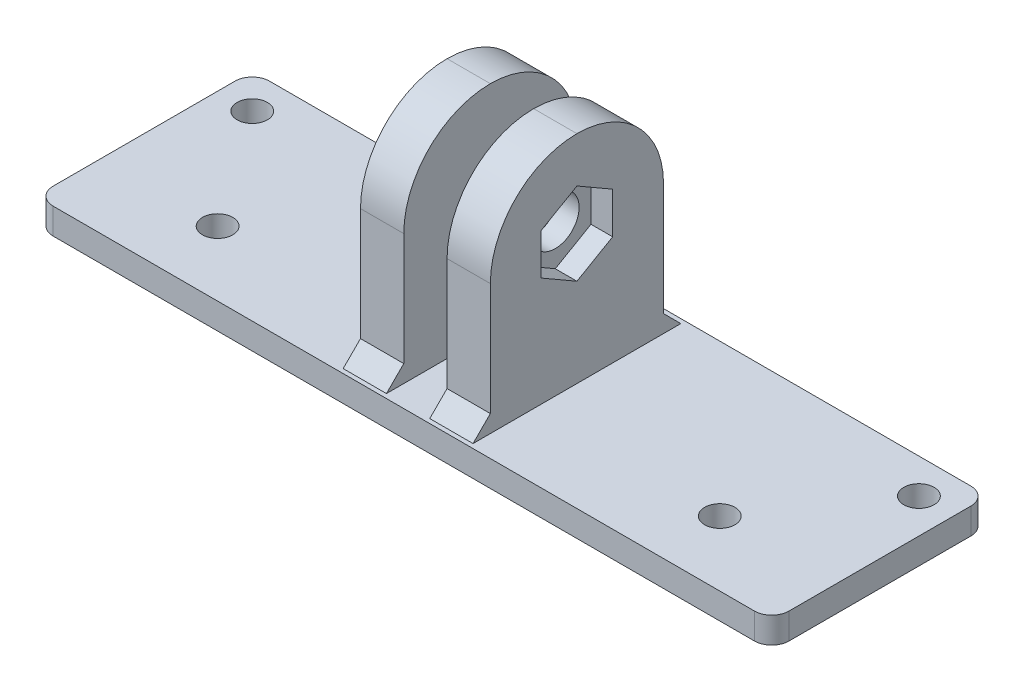
ISO-10303-21;
HEADER;
FILE_DESCRIPTION(('STEP AP214'),'2;1');
FILE_NAME('part.step','',(''),(''),'','','');
FILE_SCHEMA(('AUTOMOTIVE_DESIGN { 1 0 10303 214 1 1 1 1 }'));
ENDSEC;
DATA;
#1=APPLICATION_CONTEXT('core data for automotive mechanical design processes');
#2=APPLICATION_PROTOCOL_DEFINITION('international standard','automotive_design',2000,#1);
#3=PRODUCT_CONTEXT('',#1,'mechanical');
#4=PRODUCT('Part','Part','',(#3));
#5=PRODUCT_RELATED_PRODUCT_CATEGORY('part','',(#4));
#6=PRODUCT_DEFINITION_FORMATION('','',#4);
#7=PRODUCT_DEFINITION_CONTEXT('part definition',#1,'design');
#8=PRODUCT_DEFINITION('design','',#6,#7);
#9=PRODUCT_DEFINITION_SHAPE('','',#8);
#10=(LENGTH_UNIT() NAMED_UNIT(*) SI_UNIT(.MILLI.,.METRE.));
#11=(NAMED_UNIT(*) PLANE_ANGLE_UNIT() SI_UNIT($,.RADIAN.));
#12=(NAMED_UNIT(*) SI_UNIT($,.STERADIAN.) SOLID_ANGLE_UNIT());
#13=UNCERTAINTY_MEASURE_WITH_UNIT(LENGTH_MEASURE(1.E-05),#10,'distance_accuracy_value','');
#14=(GEOMETRIC_REPRESENTATION_CONTEXT(3) GLOBAL_UNCERTAINTY_ASSIGNED_CONTEXT((#13)) GLOBAL_UNIT_ASSIGNED_CONTEXT((#10,
#11,#12)) REPRESENTATION_CONTEXT('',''));
#15=CARTESIAN_POINT('',(0.,0.,0.));
#16=DIRECTION('',(0.,0.,1.));
#17=DIRECTION('',(1.,0.,0.));
#18=AXIS2_PLACEMENT_3D('',#15,#16,#17);
#19=CARTESIAN_POINT('',(42.5,18.,0.));
#20=DIRECTION('',(-1.,0.,0.));
#21=DIRECTION('',(0.,0.,1.));
#22=AXIS2_PLACEMENT_3D('',#19,#20,#21);
#23=CYLINDRICAL_SURFACE('',#22,2.75);
#24=CARTESIAN_POINT('',(2.49999999999994,18.,0.));
#25=DIRECTION('',(1.,0.,0.));
#26=DIRECTION('',(0.,0.,-1.));
#27=AXIS2_PLACEMENT_3D('',#24,#25,#26);
#28=CIRCLE('',#27,2.75);
#29=CARTESIAN_POINT('',(2.49999999999994,18.,-2.75));
#30=VERTEX_POINT('',#29);
#31=EDGE_CURVE('E303',#30,#30,#28,.T.);
#32=ORIENTED_EDGE('',*,*,#31,.F.);
#33=EDGE_LOOP('',(#32));
#34=FACE_BOUND('',#33,.T.);
#35=CARTESIAN_POINT('',(4.99999999999994,18.,0.));
#36=DIRECTION('',(1.,0.,0.));
#37=DIRECTION('',(0.,0.,-1.));
#38=AXIS2_PLACEMENT_3D('',#35,#36,#37);
#39=CIRCLE('',#38,2.75);
#40=CARTESIAN_POINT('',(4.99999999999994,18.,-2.75));
#41=VERTEX_POINT('',#40);
#42=EDGE_CURVE('E291',#41,#41,#39,.F.);
#43=ORIENTED_EDGE('',*,*,#42,.F.);
#44=EDGE_LOOP('',(#43));
#45=FACE_BOUND('',#44,.T.);
#46=ADVANCED_FACE('F39',(#34,#45),#23,.F.);
#47=CARTESIAN_POINT('',(0.,3.,0.));
#48=DIRECTION('',(0.,1.,0.));
#49=DIRECTION('',(0.,0.,1.));
#50=AXIS2_PLACEMENT_3D('',#47,#48,#49);
#51=PLANE('',#50);
#52=CARTESIAN_POINT('',(-38.5,3.,-8.49999999999996));
#53=DIRECTION('',(0.,1.,0.));
#54=DIRECTION('',(0.,0.,1.));
#55=AXIS2_PLACEMENT_3D('',#52,#53,#54);
#56=CIRCLE('',#55,1.75);
#57=CARTESIAN_POINT('',(-38.5,3.,-6.74999999999996));
#58=VERTEX_POINT('',#57);
#59=EDGE_CURVE('E366',#58,#58,#56,.T.);
#60=ORIENTED_EDGE('',*,*,#59,.F.);
#61=EDGE_LOOP('',(#60));
#62=FACE_BOUND('',#61,.T.);
#63=CARTESIAN_POINT('',(29.,3.,5.));
#64=DIRECTION('',(0.,1.,0.));
#65=DIRECTION('',(0.,0.,-1.));
#66=AXIS2_PLACEMENT_3D('',#63,#64,#65);
#67=CIRCLE('',#66,1.75);
#68=CARTESIAN_POINT('',(29.,3.,3.24999999999999));
#69=VERTEX_POINT('',#68);
#70=EDGE_CURVE('E360',#69,#69,#67,.T.);
#71=ORIENTED_EDGE('',*,*,#70,.F.);
#72=EDGE_LOOP('',(#71));
#73=FACE_BOUND('',#72,.T.);
#74=CARTESIAN_POINT('',(-29.,3.,5.));
#75=DIRECTION('',(0.,1.,0.));
#76=DIRECTION('',(0.,0.,1.));
#77=AXIS2_PLACEMENT_3D('',#74,#75,#76);
#78=CIRCLE('',#77,1.75);
#79=CARTESIAN_POINT('',(-29.,3.,6.75));
#80=VERTEX_POINT('',#79);
#81=EDGE_CURVE('E375',#80,#80,#78,.T.);
#82=ORIENTED_EDGE('',*,*,#81,.F.);
#83=EDGE_LOOP('',(#82));
#84=FACE_BOUND('',#83,.T.);
#85=CARTESIAN_POINT('',(38.5,3.,-8.49999999999996));
#86=DIRECTION('',(0.,1.,0.));
#87=DIRECTION('',(0.,0.,-1.));
#88=AXIS2_PLACEMENT_3D('',#85,#86,#87);
#89=CIRCLE('',#88,1.75);
#90=CARTESIAN_POINT('',(38.5,3.,-10.25));
#91=VERTEX_POINT('',#90);
#92=EDGE_CURVE('E382',#91,#91,#89,.T.);
#93=ORIENTED_EDGE('',*,*,#92,.F.);
#94=EDGE_LOOP('',(#93));
#95=FACE_BOUND('',#94,.T.);
#96=DIRECTION('',(0.,0.,-1.));
#97=VECTOR('',#96,1.);
#98=CARTESIAN_POINT('',(42.5,3.,-12.5));
#99=LINE('',#98,#97);
#100=CARTESIAN_POINT('',(42.5,3.,10.5));
#101=VERTEX_POINT('',#100);
#102=CARTESIAN_POINT('',(42.5,3.,-10.5));
#103=VERTEX_POINT('',#102);
#104=EDGE_CURVE('E402',#101,#103,#99,.T.);
#105=ORIENTED_EDGE('',*,*,#104,.T.);
#106=CARTESIAN_POINT('',(40.5,3.,-10.5));
#107=DIRECTION('',(0.,1.,0.));
#108=DIRECTION('',(0.,0.,1.));
#109=AXIS2_PLACEMENT_3D('',#106,#107,#108);
#110=CIRCLE('',#109,2.);
#111=CARTESIAN_POINT('',(40.5,3.,-12.5));
#112=VERTEX_POINT('',#111);
#113=EDGE_CURVE('E459',#103,#112,#110,.T.);
#114=ORIENTED_EDGE('',*,*,#113,.T.);
#115=DIRECTION('',(-1.,0.,0.));
#116=VECTOR('',#115,1.);
#117=CARTESIAN_POINT('',(-42.5,3.,-12.5));
#118=LINE('',#117,#116);
#119=CARTESIAN_POINT('',(-40.5,3.,-12.5));
#120=VERTEX_POINT('',#119);
#121=EDGE_CURVE('E406',#112,#120,#118,.T.);
#122=ORIENTED_EDGE('',*,*,#121,.T.);
#123=CARTESIAN_POINT('',(-40.5,3.,-10.5));
#124=DIRECTION('',(0.,1.,0.));
#125=DIRECTION('',(0.,0.,1.));
#126=AXIS2_PLACEMENT_3D('',#123,#124,#125);
#127=CIRCLE('',#126,2.);
#128=CARTESIAN_POINT('',(-42.5,3.,-10.5));
#129=VERTEX_POINT('',#128);
#130=EDGE_CURVE('E450',#120,#129,#127,.T.);
#131=ORIENTED_EDGE('',*,*,#130,.T.);
#132=DIRECTION('',(0.,0.,1.));
#133=VECTOR('',#132,1.);
#134=CARTESIAN_POINT('',(-42.5,3.,-12.5));
#135=LINE('',#134,#133);
#136=CARTESIAN_POINT('',(-42.5,3.,10.5));
#137=VERTEX_POINT('',#136);
#138=EDGE_CURVE('E393',#129,#137,#135,.T.);
#139=ORIENTED_EDGE('',*,*,#138,.T.);
#140=CARTESIAN_POINT('',(-40.5,3.,10.5));
#141=DIRECTION('',(0.,1.,0.));
#142=DIRECTION('',(0.,0.,1.));
#143=AXIS2_PLACEMENT_3D('',#140,#141,#142);
#144=CIRCLE('',#143,2.);
#145=CARTESIAN_POINT('',(-40.5,3.,12.5));
#146=VERTEX_POINT('',#145);
#147=EDGE_CURVE('E453',#137,#146,#144,.T.);
#148=ORIENTED_EDGE('',*,*,#147,.T.);
#149=DIRECTION('',(1.,0.,0.));
#150=VECTOR('',#149,1.);
#151=CARTESIAN_POINT('',(-42.5,3.,12.5));
#152=LINE('',#151,#150);
#153=CARTESIAN_POINT('',(40.5,3.,12.5));
#154=VERTEX_POINT('',#153);
#155=EDGE_CURVE('E397',#146,#154,#152,.T.);
#156=ORIENTED_EDGE('',*,*,#155,.T.);
#157=CARTESIAN_POINT('',(40.5,3.,10.5));
#158=DIRECTION('',(0.,1.,0.));
#159=DIRECTION('',(0.,0.,1.));
#160=AXIS2_PLACEMENT_3D('',#157,#158,#159);
#161=CIRCLE('',#160,2.);
#162=EDGE_CURVE('E456',#154,#101,#161,.T.);
#163=ORIENTED_EDGE('',*,*,#162,.T.);
#164=EDGE_LOOP('',(#105,#114,#122,#131,#139,#148,#156,#163));
#165=FACE_BOUND('',#164,.T.);
#166=DIRECTION('',(0.,0.,1.));
#167=VECTOR('',#166,1.);
#168=CARTESIAN_POINT('',(-7.5,3.,-10.));
#169=LINE('',#168,#167);
#170=CARTESIAN_POINT('',(-7.5,3.,-12.));
#171=VERTEX_POINT('',#170);
#172=CARTESIAN_POINT('',(-7.5,3.,12.));
#173=VERTEX_POINT('',#172);
#174=EDGE_CURVE('E341',#171,#173,#169,.T.);
#175=ORIENTED_EDGE('',*,*,#174,.F.);
#176=DIRECTION('',(1.,0.,0.));
#177=VECTOR('',#176,1.);
#178=CARTESIAN_POINT('',(0.,3.,-12.));
#179=LINE('',#178,#177);
#180=CARTESIAN_POINT('',(-2.5,3.,-12.));
#181=VERTEX_POINT('',#180);
#182=EDGE_CURVE('E535',#171,#181,#179,.T.);
#183=ORIENTED_EDGE('',*,*,#182,.T.);
#184=DIRECTION('',(0.,0.,-1.));
#185=VECTOR('',#184,1.);
#186=CARTESIAN_POINT('',(-2.5,3.,-9.99999999999999));
#187=LINE('',#186,#185);
#188=CARTESIAN_POINT('',(-2.5,3.,12.));
#189=VERTEX_POINT('',#188);
#190=EDGE_CURVE('E338',#189,#181,#187,.T.);
#191=ORIENTED_EDGE('',*,*,#190,.F.);
#192=DIRECTION('',(-1.,0.,0.));
#193=VECTOR('',#192,1.);
#194=CARTESIAN_POINT('',(0.,3.,12.));
#195=LINE('',#194,#193);
#196=EDGE_CURVE('E531',#189,#173,#195,.T.);
#197=ORIENTED_EDGE('',*,*,#196,.T.);
#198=EDGE_LOOP('',(#175,#183,#191,#197));
#199=FACE_BOUND('',#198,.T.);
#200=DIRECTION('',(0.,0.,1.));
#201=VECTOR('',#200,1.);
#202=CARTESIAN_POINT('',(2.49999999999994,3.,-9.99999999999999));
#203=LINE('',#202,#201);
#204=CARTESIAN_POINT('',(2.49999999999994,3.,-12.));
#205=VERTEX_POINT('',#204);
#206=CARTESIAN_POINT('',(2.49999999999994,3.,12.));
#207=VERTEX_POINT('',#206);
#208=EDGE_CURVE('E316',#205,#207,#203,.T.);
#209=ORIENTED_EDGE('',*,*,#208,.F.);
#210=DIRECTION('',(1.,0.,0.));
#211=VECTOR('',#210,1.);
#212=CARTESIAN_POINT('',(0.,3.,-12.));
#213=LINE('',#212,#211);
#214=CARTESIAN_POINT('',(7.49999999999994,3.,-12.));
#215=VERTEX_POINT('',#214);
#216=EDGE_CURVE('E539',#205,#215,#213,.T.);
#217=ORIENTED_EDGE('',*,*,#216,.T.);
#218=DIRECTION('',(0.,0.,-1.));
#219=VECTOR('',#218,1.);
#220=CARTESIAN_POINT('',(7.49999999999994,3.,-10.));
#221=LINE('',#220,#219);
#222=CARTESIAN_POINT('',(7.49999999999994,3.,12.));
#223=VERTEX_POINT('',#222);
#224=EDGE_CURVE('E319',#223,#215,#221,.T.);
#225=ORIENTED_EDGE('',*,*,#224,.F.);
#226=DIRECTION('',(-1.,0.,0.));
#227=VECTOR('',#226,1.);
#228=CARTESIAN_POINT('',(0.,3.,12.));
#229=LINE('',#228,#227);
#230=EDGE_CURVE('E527',#223,#207,#229,.T.);
#231=ORIENTED_EDGE('',*,*,#230,.T.);
#232=EDGE_LOOP('',(#209,#217,#225,#231));
#233=FACE_BOUND('',#232,.T.);
#234=ADVANCED_FACE('F579',(#62,#73,#84,#95,#165,#199,#233),#51,.T.);
#235=CARTESIAN_POINT('',(-42.5,3.,-12.5));
#236=DIRECTION('',(1.,0.,0.));
#237=DIRECTION('',(0.,0.,-1.));
#238=AXIS2_PLACEMENT_3D('',#235,#236,#237);
#239=PLANE('',#238);
#240=DIRECTION('',(0.,0.,1.));
#241=VECTOR('',#240,1.);
#242=CARTESIAN_POINT('',(-42.5,0.,-12.5));
#243=LINE('',#242,#241);
#244=CARTESIAN_POINT('',(-42.5,0.,-10.5));
#245=VERTEX_POINT('',#244);
#246=CARTESIAN_POINT('',(-42.5,0.,10.5));
#247=VERTEX_POINT('',#246);
#248=EDGE_CURVE('E365',#245,#247,#243,.T.);
#249=ORIENTED_EDGE('',*,*,#248,.T.);
#250=DIRECTION('',(0.,-1.,0.));
#251=VECTOR('',#250,1.);
#252=CARTESIAN_POINT('',(-42.5,3.,10.5));
#253=LINE('',#252,#251);
#254=EDGE_CURVE('E473',#247,#137,#253,.F.);
#255=ORIENTED_EDGE('',*,*,#254,.T.);
#256=ORIENTED_EDGE('',*,*,#138,.F.);
#257=DIRECTION('',(0.,-1.,0.));
#258=VECTOR('',#257,1.);
#259=CARTESIAN_POINT('',(-42.5,3.,-10.5));
#260=LINE('',#259,#258);
#261=EDGE_CURVE('E469',#129,#245,#260,.T.);
#262=ORIENTED_EDGE('',*,*,#261,.T.);
#263=EDGE_LOOP('',(#249,#255,#256,#262));
#264=FACE_BOUND('',#263,.T.);
#265=ADVANCED_FACE('F619',(#264),#239,.F.);
#266=CARTESIAN_POINT('',(-42.5,3.,12.5));
#267=DIRECTION('',(0.,0.,-1.));
#268=DIRECTION('',(-1.,0.,0.));
#269=AXIS2_PLACEMENT_3D('',#266,#267,#268);
#270=PLANE('',#269);
#271=DIRECTION('',(1.,0.,0.));
#272=VECTOR('',#271,1.);
#273=CARTESIAN_POINT('',(-42.5,0.,12.5));
#274=LINE('',#273,#272);
#275=CARTESIAN_POINT('',(-40.5,0.,12.5));
#276=VERTEX_POINT('',#275);
#277=CARTESIAN_POINT('',(40.5,0.,12.5));
#278=VERTEX_POINT('',#277);
#279=EDGE_CURVE('E414',#276,#278,#274,.T.);
#280=ORIENTED_EDGE('',*,*,#279,.T.);
#281=DIRECTION('',(0.,-1.,0.));
#282=VECTOR('',#281,1.);
#283=CARTESIAN_POINT('',(40.5,3.,12.5));
#284=LINE('',#283,#282);
#285=EDGE_CURVE('E466',#278,#154,#284,.F.);
#286=ORIENTED_EDGE('',*,*,#285,.T.);
#287=ORIENTED_EDGE('',*,*,#155,.F.);
#288=DIRECTION('',(0.,-1.,0.));
#289=VECTOR('',#288,1.);
#290=CARTESIAN_POINT('',(-40.5,3.,12.5));
#291=LINE('',#290,#289);
#292=EDGE_CURVE('E462',#146,#276,#291,.T.);
#293=ORIENTED_EDGE('',*,*,#292,.T.);
#294=EDGE_LOOP('',(#280,#286,#287,#293));
#295=FACE_BOUND('',#294,.T.);
#296=ADVANCED_FACE('F706',(#295),#270,.F.);
#297=CARTESIAN_POINT('',(42.5,3.,-12.5));
#298=DIRECTION('',(-1.,0.,0.));
#299=DIRECTION('',(0.,0.,1.));
#300=AXIS2_PLACEMENT_3D('',#297,#298,#299);
#301=PLANE('',#300);
#302=DIRECTION('',(0.,0.,-1.));
#303=VECTOR('',#302,1.);
#304=CARTESIAN_POINT('',(42.5,0.,-12.5));
#305=LINE('',#304,#303);
#306=CARTESIAN_POINT('',(42.5,0.,10.5));
#307=VERTEX_POINT('',#306);
#308=CARTESIAN_POINT('',(42.5,0.,-10.5));
#309=VERTEX_POINT('',#308);
#310=EDGE_CURVE('E418',#307,#309,#305,.T.);
#311=ORIENTED_EDGE('',*,*,#310,.T.);
#312=DIRECTION('',(0.,-1.,0.));
#313=VECTOR('',#312,1.);
#314=CARTESIAN_POINT('',(42.5,3.,-10.5));
#315=LINE('',#314,#313);
#316=EDGE_CURVE('E447',#309,#103,#315,.F.);
#317=ORIENTED_EDGE('',*,*,#316,.T.);
#318=ORIENTED_EDGE('',*,*,#104,.F.);
#319=DIRECTION('',(0.,-1.,0.));
#320=VECTOR('',#319,1.);
#321=CARTESIAN_POINT('',(42.5,3.,10.5));
#322=LINE('',#321,#320);
#323=EDGE_CURVE('E443',#101,#307,#322,.T.);
#324=ORIENTED_EDGE('',*,*,#323,.T.);
#325=EDGE_LOOP('',(#311,#317,#318,#324));
#326=FACE_BOUND('',#325,.T.);
#327=ADVANCED_FACE('F710',(#326),#301,.F.);
#328=CARTESIAN_POINT('',(-42.5,3.,-12.5));
#329=DIRECTION('',(0.,0.,1.));
#330=DIRECTION('',(1.,0.,0.));
#331=AXIS2_PLACEMENT_3D('',#328,#329,#330);
#332=PLANE('',#331);
#333=ORIENTED_EDGE('',*,*,#121,.F.);
#334=DIRECTION('',(0.,-1.,0.));
#335=VECTOR('',#334,1.);
#336=CARTESIAN_POINT('',(40.5,3.,-12.5));
#337=LINE('',#336,#335);
#338=CARTESIAN_POINT('',(40.5,0.,-12.5));
#339=VERTEX_POINT('',#338);
#340=EDGE_CURVE('E427',#112,#339,#337,.T.);
#341=ORIENTED_EDGE('',*,*,#340,.T.);
#342=DIRECTION('',(-1.,0.,0.));
#343=VECTOR('',#342,1.);
#344=CARTESIAN_POINT('',(-42.5,0.,-12.5));
#345=LINE('',#344,#343);
#346=CARTESIAN_POINT('',(-40.5,0.,-12.5));
#347=VERTEX_POINT('',#346);
#348=EDGE_CURVE('E398',#339,#347,#345,.T.);
#349=ORIENTED_EDGE('',*,*,#348,.T.);
#350=DIRECTION('',(0.,-1.,0.));
#351=VECTOR('',#350,1.);
#352=CARTESIAN_POINT('',(-40.5,3.,-12.5));
#353=LINE('',#352,#351);
#354=EDGE_CURVE('E410',#347,#120,#353,.F.);
#355=ORIENTED_EDGE('',*,*,#354,.T.);
#356=EDGE_LOOP('',(#333,#341,#349,#355));
#357=FACE_BOUND('',#356,.T.);
#358=ADVANCED_FACE('F714',(#357),#332,.F.);
#359=CARTESIAN_POINT('',(0.,0.,0.));
#360=DIRECTION('',(0.,1.,0.));
#361=DIRECTION('',(0.,0.,1.));
#362=AXIS2_PLACEMENT_3D('',#359,#360,#361);
#363=PLANE('',#362);
#364=CARTESIAN_POINT('',(-38.5,0.,-8.49999999999996));
#365=DIRECTION('',(0.,1.,0.));
#366=DIRECTION('',(0.,0.,1.));
#367=AXIS2_PLACEMENT_3D('',#364,#365,#366);
#368=CIRCLE('',#367,1.75);
#369=CARTESIAN_POINT('',(-38.5,0.,-6.74999999999996));
#370=VERTEX_POINT('',#369);
#371=EDGE_CURVE('E361',#370,#370,#368,.T.);
#372=ORIENTED_EDGE('',*,*,#371,.T.);
#373=EDGE_LOOP('',(#372));
#374=FACE_BOUND('',#373,.T.);
#375=CARTESIAN_POINT('',(29.,0.,5.));
#376=DIRECTION('',(0.,1.,0.));
#377=DIRECTION('',(0.,0.,-1.));
#378=AXIS2_PLACEMENT_3D('',#375,#376,#377);
#379=CIRCLE('',#378,1.75);
#380=CARTESIAN_POINT('',(29.,0.,3.24999999999999));
#381=VERTEX_POINT('',#380);
#382=EDGE_CURVE('E371',#381,#381,#379,.T.);
#383=ORIENTED_EDGE('',*,*,#382,.T.);
#384=EDGE_LOOP('',(#383));
#385=FACE_BOUND('',#384,.T.);
#386=CARTESIAN_POINT('',(-29.,0.,5.));
#387=DIRECTION('',(0.,1.,0.));
#388=DIRECTION('',(0.,0.,1.));
#389=AXIS2_PLACEMENT_3D('',#386,#387,#388);
#390=CIRCLE('',#389,1.75);
#391=CARTESIAN_POINT('',(-29.,0.,6.75));
#392=VERTEX_POINT('',#391);
#393=EDGE_CURVE('E386',#392,#392,#390,.T.);
#394=ORIENTED_EDGE('',*,*,#393,.T.);
#395=EDGE_LOOP('',(#394));
#396=FACE_BOUND('',#395,.T.);
#397=CARTESIAN_POINT('',(38.5,0.,-8.49999999999996));
#398=DIRECTION('',(0.,1.,0.));
#399=DIRECTION('',(0.,0.,-1.));
#400=AXIS2_PLACEMENT_3D('',#397,#398,#399);
#401=CIRCLE('',#400,1.75);
#402=CARTESIAN_POINT('',(38.5,0.,-10.25));
#403=VERTEX_POINT('',#402);
#404=EDGE_CURVE('E370',#403,#403,#401,.T.);
#405=ORIENTED_EDGE('',*,*,#404,.T.);
#406=EDGE_LOOP('',(#405));
#407=FACE_BOUND('',#406,.T.);
#408=ORIENTED_EDGE('',*,*,#348,.F.);
#409=CARTESIAN_POINT('',(40.5,0.,-10.5));
#410=DIRECTION('',(0.,1.,0.));
#411=DIRECTION('',(0.,0.,1.));
#412=AXIS2_PLACEMENT_3D('',#409,#410,#411);
#413=CIRCLE('',#412,2.);
#414=EDGE_CURVE('E440',#339,#309,#413,.F.);
#415=ORIENTED_EDGE('',*,*,#414,.T.);
#416=ORIENTED_EDGE('',*,*,#310,.F.);
#417=CARTESIAN_POINT('',(40.5,0.,10.5));
#418=DIRECTION('',(0.,1.,0.));
#419=DIRECTION('',(0.,0.,1.));
#420=AXIS2_PLACEMENT_3D('',#417,#418,#419);
#421=CIRCLE('',#420,2.);
#422=EDGE_CURVE('E437',#307,#278,#421,.F.);
#423=ORIENTED_EDGE('',*,*,#422,.T.);
#424=ORIENTED_EDGE('',*,*,#279,.F.);
#425=CARTESIAN_POINT('',(-40.5,0.,10.5));
#426=DIRECTION('',(0.,1.,0.));
#427=DIRECTION('',(0.,0.,1.));
#428=AXIS2_PLACEMENT_3D('',#425,#426,#427);
#429=CIRCLE('',#428,2.);
#430=EDGE_CURVE('E434',#276,#247,#429,.F.);
#431=ORIENTED_EDGE('',*,*,#430,.T.);
#432=ORIENTED_EDGE('',*,*,#248,.F.);
#433=CARTESIAN_POINT('',(-40.5,0.,-10.5));
#434=DIRECTION('',(0.,1.,0.));
#435=DIRECTION('',(0.,0.,1.));
#436=AXIS2_PLACEMENT_3D('',#433,#434,#435);
#437=CIRCLE('',#436,2.);
#438=EDGE_CURVE('E431',#245,#347,#437,.F.);
#439=ORIENTED_EDGE('',*,*,#438,.T.);
#440=EDGE_LOOP('',(#408,#415,#416,#423,#424,#431,#432,#439));
#441=FACE_BOUND('',#440,.T.);
#442=ADVANCED_FACE('F718',(#374,#385,#396,#407,#441),#363,.F.);
#443=CARTESIAN_POINT('',(38.5,0.,-8.49999999999996));
#444=DIRECTION('',(0.,1.,0.));
#445=DIRECTION('',(0.,0.,1.));
#446=AXIS2_PLACEMENT_3D('',#443,#444,#445);
#447=CYLINDRICAL_SURFACE('',#446,1.75);
#448=ORIENTED_EDGE('',*,*,#404,.F.);
#449=EDGE_LOOP('',(#448));
#450=FACE_BOUND('',#449,.T.);
#451=ORIENTED_EDGE('',*,*,#92,.T.);
#452=EDGE_LOOP('',(#451));
#453=FACE_BOUND('',#452,.T.);
#454=ADVANCED_FACE('F721',(#450,#453),#447,.F.);
#455=CARTESIAN_POINT('',(-29.,0.,5.));
#456=DIRECTION('',(0.,1.,0.));
#457=DIRECTION('',(0.,0.,1.));
#458=AXIS2_PLACEMENT_3D('',#455,#456,#457);
#459=CYLINDRICAL_SURFACE('',#458,1.75);
#460=ORIENTED_EDGE('',*,*,#393,.F.);
#461=EDGE_LOOP('',(#460));
#462=FACE_BOUND('',#461,.T.);
#463=ORIENTED_EDGE('',*,*,#81,.T.);
#464=EDGE_LOOP('',(#463));
#465=FACE_BOUND('',#464,.T.);
#466=ADVANCED_FACE('F724',(#462,#465),#459,.F.);
#467=CARTESIAN_POINT('',(29.,0.,5.));
#468=DIRECTION('',(0.,1.,0.));
#469=DIRECTION('',(0.,0.,1.));
#470=AXIS2_PLACEMENT_3D('',#467,#468,#469);
#471=CYLINDRICAL_SURFACE('',#470,1.75);
#472=ORIENTED_EDGE('',*,*,#382,.F.);
#473=EDGE_LOOP('',(#472));
#474=FACE_BOUND('',#473,.T.);
#475=ORIENTED_EDGE('',*,*,#70,.T.);
#476=EDGE_LOOP('',(#475));
#477=FACE_BOUND('',#476,.T.);
#478=ADVANCED_FACE('F727',(#474,#477),#471,.F.);
#479=CARTESIAN_POINT('',(-38.5,0.,-8.49999999999996));
#480=DIRECTION('',(0.,1.,0.));
#481=DIRECTION('',(0.,0.,1.));
#482=AXIS2_PLACEMENT_3D('',#479,#480,#481);
#483=CYLINDRICAL_SURFACE('',#482,1.75);
#484=ORIENTED_EDGE('',*,*,#371,.F.);
#485=EDGE_LOOP('',(#484));
#486=FACE_BOUND('',#485,.T.);
#487=ORIENTED_EDGE('',*,*,#59,.T.);
#488=EDGE_LOOP('',(#487));
#489=FACE_BOUND('',#488,.T.);
#490=ADVANCED_FACE('F702',(#486,#489),#483,.F.);
#491=CARTESIAN_POINT('',(40.5,3.,-10.5));
#492=DIRECTION('',(0.,-1.,0.));
#493=DIRECTION('',(0.,0.,-1.));
#494=AXIS2_PLACEMENT_3D('',#491,#492,#493);
#495=CYLINDRICAL_SURFACE('',#494,2.);
#496=ORIENTED_EDGE('',*,*,#113,.F.);
#497=ORIENTED_EDGE('',*,*,#316,.F.);
#498=ORIENTED_EDGE('',*,*,#414,.F.);
#499=ORIENTED_EDGE('',*,*,#340,.F.);
#500=EDGE_LOOP('',(#496,#497,#498,#499));
#501=FACE_BOUND('',#500,.T.);
#502=ADVANCED_FACE('F698',(#501),#495,.T.);
#503=CARTESIAN_POINT('',(40.5,3.,10.5));
#504=DIRECTION('',(0.,-1.,0.));
#505=DIRECTION('',(0.,0.,-1.));
#506=AXIS2_PLACEMENT_3D('',#503,#504,#505);
#507=CYLINDRICAL_SURFACE('',#506,2.);
#508=ORIENTED_EDGE('',*,*,#162,.F.);
#509=ORIENTED_EDGE('',*,*,#285,.F.);
#510=ORIENTED_EDGE('',*,*,#422,.F.);
#511=ORIENTED_EDGE('',*,*,#323,.F.);
#512=EDGE_LOOP('',(#508,#509,#510,#511));
#513=FACE_BOUND('',#512,.T.);
#514=ADVANCED_FACE('F694',(#513),#507,.T.);
#515=CARTESIAN_POINT('',(-40.5,3.,10.5));
#516=DIRECTION('',(0.,-1.,0.));
#517=DIRECTION('',(0.,0.,-1.));
#518=AXIS2_PLACEMENT_3D('',#515,#516,#517);
#519=CYLINDRICAL_SURFACE('',#518,2.);
#520=ORIENTED_EDGE('',*,*,#147,.F.);
#521=ORIENTED_EDGE('',*,*,#254,.F.);
#522=ORIENTED_EDGE('',*,*,#430,.F.);
#523=ORIENTED_EDGE('',*,*,#292,.F.);
#524=EDGE_LOOP('',(#520,#521,#522,#523));
#525=FACE_BOUND('',#524,.T.);
#526=ADVANCED_FACE('F690',(#525),#519,.T.);
#527=CARTESIAN_POINT('',(-40.5,3.,-10.5));
#528=DIRECTION('',(0.,-1.,0.));
#529=DIRECTION('',(0.,0.,-1.));
#530=AXIS2_PLACEMENT_3D('',#527,#528,#529);
#531=CYLINDRICAL_SURFACE('',#530,2.);
#532=ORIENTED_EDGE('',*,*,#130,.F.);
#533=ORIENTED_EDGE('',*,*,#354,.F.);
#534=ORIENTED_EDGE('',*,*,#438,.F.);
#535=ORIENTED_EDGE('',*,*,#261,.F.);
#536=EDGE_LOOP('',(#532,#533,#534,#535));
#537=FACE_BOUND('',#536,.T.);
#538=ADVANCED_FACE('F645',(#537),#531,.T.);
#539=CARTESIAN_POINT('',(-2.5,28.,-9.99999999999999));
#540=DIRECTION('',(-1.,0.,0.));
#541=DIRECTION('',(0.,0.,1.));
#542=AXIS2_PLACEMENT_3D('',#539,#540,#541);
#543=PLANE('',#542);
#544=CARTESIAN_POINT('',(-2.5,18.,0.));
#545=DIRECTION('',(-1.,0.,0.));
#546=DIRECTION('',(0.,0.,1.));
#547=AXIS2_PLACEMENT_3D('',#544,#545,#546);
#548=CIRCLE('',#547,2.75);
#549=CARTESIAN_POINT('',(-2.5,18.,2.75));
#550=VERTEX_POINT('',#549);
#551=EDGE_CURVE('E311',#550,#550,#548,.T.);
#552=ORIENTED_EDGE('',*,*,#551,.T.);
#553=EDGE_LOOP('',(#552));
#554=FACE_BOUND('',#553,.T.);
#555=DIRECTION('',(0.,-1.,0.));
#556=VECTOR('',#555,1.);
#557=CARTESIAN_POINT('',(-2.5,28.,-9.99999999999999));
#558=LINE('',#557,#556);
#559=CARTESIAN_POINT('',(-2.5,18.,-9.99999999999999));
#560=VERTEX_POINT('',#559);
#561=CARTESIAN_POINT('',(-2.5,5.,-9.99999999999999));
#562=VERTEX_POINT('',#561);
#563=EDGE_CURVE('E356',#560,#562,#558,.T.);
#564=ORIENTED_EDGE('',*,*,#563,.F.);
#565=CARTESIAN_POINT('',(-2.5,18.,0.));
#566=DIRECTION('',(-1.,0.,0.));
#567=DIRECTION('',(0.,0.,1.));
#568=AXIS2_PLACEMENT_3D('',#565,#566,#567);
#569=CIRCLE('',#568,10.);
#570=CARTESIAN_POINT('',(-2.5,28.,0.));
#571=VERTEX_POINT('',#570);
#572=EDGE_CURVE('E508',#560,#571,#569,.F.);
#573=ORIENTED_EDGE('',*,*,#572,.T.);
#574=CARTESIAN_POINT('',(-2.5,18.,0.));
#575=DIRECTION('',(-1.,0.,0.));
#576=DIRECTION('',(0.,0.,1.));
#577=AXIS2_PLACEMENT_3D('',#574,#575,#576);
#578=CIRCLE('',#577,10.);
#579=CARTESIAN_POINT('',(-2.5,18.,9.99999999999999));
#580=VERTEX_POINT('',#579);
#581=EDGE_CURVE('E505',#571,#580,#578,.F.);
#582=ORIENTED_EDGE('',*,*,#581,.T.);
#583=DIRECTION('',(0.,-1.,0.));
#584=VECTOR('',#583,1.);
#585=CARTESIAN_POINT('',(-2.5,28.,9.99999999999999));
#586=LINE('',#585,#584);
#587=CARTESIAN_POINT('',(-2.5,5.,9.99999999999999));
#588=VERTEX_POINT('',#587);
#589=EDGE_CURVE('E344',#580,#588,#586,.T.);
#590=ORIENTED_EDGE('',*,*,#589,.T.);
#591=DIRECTION('',(0.,-0.70710678118655,0.707106781186545));
#592=VECTOR('',#591,1.);
#593=CARTESIAN_POINT('',(-2.5,26.5000000000001,-11.4999999999999));
#594=LINE('',#593,#592);
#595=EDGE_CURVE('E568',#588,#189,#594,.T.);
#596=ORIENTED_EDGE('',*,*,#595,.T.);
#597=ORIENTED_EDGE('',*,*,#190,.T.);
#598=DIRECTION('',(0.,0.70710678118655,0.707106781186545));
#599=VECTOR('',#598,1.);
#600=CARTESIAN_POINT('',(-2.5,16.5000000000001,1.5));
#601=LINE('',#600,#599);
#602=EDGE_CURVE('E565',#181,#562,#601,.T.);
#603=ORIENTED_EDGE('',*,*,#602,.T.);
#604=EDGE_LOOP('',(#564,#573,#582,#590,#596,#597,#603));
#605=FACE_BOUND('',#604,.T.);
#606=ADVANCED_FACE('F641',(#554,#605),#543,.F.);
#607=CARTESIAN_POINT('',(-2.5,28.,-9.99999999999999));
#608=DIRECTION('',(0.,0.,1.));
#609=DIRECTION('',(1.,0.,0.));
#610=AXIS2_PLACEMENT_3D('',#607,#608,#609);
#611=PLANE('',#610);
#612=ORIENTED_EDGE('',*,*,#563,.T.);
#613=DIRECTION('',(-1.,0.,0.));
#614=VECTOR('',#613,1.);
#615=CARTESIAN_POINT('',(-2.5,5.,-9.99999999999999));
#616=LINE('',#615,#614);
#617=CARTESIAN_POINT('',(-7.5,5.,-10.));
#618=VERTEX_POINT('',#617);
#619=EDGE_CURVE('E543',#562,#618,#616,.T.);
#620=ORIENTED_EDGE('',*,*,#619,.T.);
#621=DIRECTION('',(0.,-1.,0.));
#622=VECTOR('',#621,1.);
#623=CARTESIAN_POINT('',(-7.5,28.,-10.));
#624=LINE('',#623,#622);
#625=CARTESIAN_POINT('',(-7.5,18.,-10.));
#626=VERTEX_POINT('',#625);
#627=EDGE_CURVE('E352',#626,#618,#624,.T.);
#628=ORIENTED_EDGE('',*,*,#627,.F.);
#629=DIRECTION('',(-1.,0.,0.));
#630=VECTOR('',#629,1.);
#631=CARTESIAN_POINT('',(-2.5,18.,-9.99999999999999));
#632=LINE('',#631,#630);
#633=EDGE_CURVE('E501',#626,#560,#632,.F.);
#634=ORIENTED_EDGE('',*,*,#633,.T.);
#635=EDGE_LOOP('',(#612,#620,#628,#634));
#636=FACE_BOUND('',#635,.T.);
#637=ADVANCED_FACE('F644',(#636),#611,.F.);
#638=CARTESIAN_POINT('',(-7.5,28.,-10.));
#639=DIRECTION('',(1.,0.,0.));
#640=DIRECTION('',(0.,0.,-1.));
#641=AXIS2_PLACEMENT_3D('',#638,#639,#640);
#642=PLANE('',#641);
#643=CARTESIAN_POINT('',(-7.5,18.,0.));
#644=DIRECTION('',(1.,0.,0.));
#645=DIRECTION('',(0.,0.,-1.));
#646=AXIS2_PLACEMENT_3D('',#643,#644,#645);
#647=CIRCLE('',#646,2.75);
#648=CARTESIAN_POINT('',(-7.5,18.,-2.75));
#649=VERTEX_POINT('',#648);
#650=EDGE_CURVE('E307',#649,#649,#647,.T.);
#651=ORIENTED_EDGE('',*,*,#650,.T.);
#652=EDGE_LOOP('',(#651));
#653=FACE_BOUND('',#652,.T.);
#654=CARTESIAN_POINT('',(-7.5,18.,0.));
#655=DIRECTION('',(1.,0.,0.));
#656=DIRECTION('',(0.,0.,-1.));
#657=AXIS2_PLACEMENT_3D('',#654,#655,#656);
#658=CIRCLE('',#657,10.);
#659=CARTESIAN_POINT('',(-7.5,18.,10.));
#660=VERTEX_POINT('',#659);
#661=CARTESIAN_POINT('',(-7.5,28.,0.));
#662=VERTEX_POINT('',#661);
#663=EDGE_CURVE('E495',#660,#662,#658,.F.);
#664=ORIENTED_EDGE('',*,*,#663,.T.);
#665=CARTESIAN_POINT('',(-7.5,18.,0.));
#666=DIRECTION('',(1.,0.,0.));
#667=DIRECTION('',(0.,0.,-1.));
#668=AXIS2_PLACEMENT_3D('',#665,#666,#667);
#669=CIRCLE('',#668,10.);
#670=EDGE_CURVE('E498',#662,#626,#669,.F.);
#671=ORIENTED_EDGE('',*,*,#670,.T.);
#672=ORIENTED_EDGE('',*,*,#627,.T.);
#673=DIRECTION('',(0.,-0.70710678118655,-0.707106781186545));
#674=VECTOR('',#673,1.);
#675=CARTESIAN_POINT('',(-7.5,16.5000000000001,1.5));
#676=LINE('',#675,#674);
#677=EDGE_CURVE('E561',#618,#171,#676,.T.);
#678=ORIENTED_EDGE('',*,*,#677,.T.);
#679=ORIENTED_EDGE('',*,*,#174,.T.);
#680=DIRECTION('',(0.,0.70710678118655,-0.707106781186545));
#681=VECTOR('',#680,1.);
#682=CARTESIAN_POINT('',(-7.5,26.5000000000001,-11.4999999999999));
#683=LINE('',#682,#681);
#684=CARTESIAN_POINT('',(-7.5,5.,10.));
#685=VERTEX_POINT('',#684);
#686=EDGE_CURVE('E572',#173,#685,#683,.T.);
#687=ORIENTED_EDGE('',*,*,#686,.T.);
#688=DIRECTION('',(0.,-1.,0.));
#689=VECTOR('',#688,1.);
#690=CARTESIAN_POINT('',(-7.5,28.,10.));
#691=LINE('',#690,#689);
#692=EDGE_CURVE('E348',#660,#685,#691,.T.);
#693=ORIENTED_EDGE('',*,*,#692,.F.);
#694=EDGE_LOOP('',(#664,#671,#672,#678,#679,#687,#693));
#695=FACE_BOUND('',#694,.T.);
#696=ADVANCED_FACE('F658',(#653,#695),#642,.F.);
#697=CARTESIAN_POINT('',(-2.5,28.,9.99999999999999));
#698=DIRECTION('',(0.,0.,-1.));
#699=DIRECTION('',(-1.,0.,0.));
#700=AXIS2_PLACEMENT_3D('',#697,#698,#699);
#701=PLANE('',#700);
#702=ORIENTED_EDGE('',*,*,#692,.T.);
#703=DIRECTION('',(1.,0.,0.));
#704=VECTOR('',#703,1.);
#705=CARTESIAN_POINT('',(-2.5,5.,9.99999999999999));
#706=LINE('',#705,#704);
#707=EDGE_CURVE('E547',#685,#588,#706,.T.);
#708=ORIENTED_EDGE('',*,*,#707,.T.);
#709=ORIENTED_EDGE('',*,*,#589,.F.);
#710=DIRECTION('',(1.,0.,0.));
#711=VECTOR('',#710,1.);
#712=CARTESIAN_POINT('',(-2.5,18.,9.99999999999999));
#713=LINE('',#712,#711);
#714=EDGE_CURVE('E511',#580,#660,#713,.F.);
#715=ORIENTED_EDGE('',*,*,#714,.T.);
#716=EDGE_LOOP('',(#702,#708,#709,#715));
#717=FACE_BOUND('',#716,.T.);
#718=ADVANCED_FACE('F610',(#717),#701,.F.);
#719=CARTESIAN_POINT('',(2.49999999999994,28.,-9.99999999999999));
#720=DIRECTION('',(0.,0.,1.));
#721=DIRECTION('',(1.,0.,0.));
#722=AXIS2_PLACEMENT_3D('',#719,#720,#721);
#723=PLANE('',#722);
#724=DIRECTION('',(0.,-1.,0.));
#725=VECTOR('',#724,1.);
#726=CARTESIAN_POINT('',(7.49999999999994,28.,-10.));
#727=LINE('',#726,#725);
#728=CARTESIAN_POINT('',(7.49999999999994,18.,-10.));
#729=VERTEX_POINT('',#728);
#730=CARTESIAN_POINT('',(7.49999999999994,5.,-10.));
#731=VERTEX_POINT('',#730);
#732=EDGE_CURVE('E323',#729,#731,#727,.T.);
#733=ORIENTED_EDGE('',*,*,#732,.T.);
#734=DIRECTION('',(-1.,0.,0.));
#735=VECTOR('',#734,1.);
#736=CARTESIAN_POINT('',(2.49999999999994,5.,-9.99999999999999));
#737=LINE('',#736,#735);
#738=CARTESIAN_POINT('',(2.49999999999994,5.,-9.99999999999999));
#739=VERTEX_POINT('',#738);
#740=EDGE_CURVE('E514',#731,#739,#737,.T.);
#741=ORIENTED_EDGE('',*,*,#740,.T.);
#742=DIRECTION('',(0.,-1.,0.));
#743=VECTOR('',#742,1.);
#744=CARTESIAN_POINT('',(2.49999999999994,28.,-9.99999999999999));
#745=LINE('',#744,#743);
#746=CARTESIAN_POINT('',(2.49999999999994,18.,-9.99999999999999));
#747=VERTEX_POINT('',#746);
#748=EDGE_CURVE('E334',#747,#739,#745,.T.);
#749=ORIENTED_EDGE('',*,*,#748,.F.);
#750=DIRECTION('',(-1.,0.,0.));
#751=VECTOR('',#750,1.);
#752=CARTESIAN_POINT('',(2.49999999999994,18.,-9.99999999999999));
#753=LINE('',#752,#751);
#754=EDGE_CURVE('E492',#747,#729,#753,.F.);
#755=ORIENTED_EDGE('',*,*,#754,.T.);
#756=EDGE_LOOP('',(#733,#741,#749,#755));
#757=FACE_BOUND('',#756,.T.);
#758=ADVANCED_FACE('F588',(#757),#723,.F.);
#759=CARTESIAN_POINT('',(2.49999999999994,28.,-9.99999999999999));
#760=DIRECTION('',(1.,0.,0.));
#761=DIRECTION('',(0.,0.,-1.));
#762=AXIS2_PLACEMENT_3D('',#759,#760,#761);
#763=PLANE('',#762);
#764=ORIENTED_EDGE('',*,*,#31,.T.);
#765=EDGE_LOOP('',(#764));
#766=FACE_BOUND('',#765,.T.);
#767=DIRECTION('',(0.,-1.,0.));
#768=VECTOR('',#767,1.);
#769=CARTESIAN_POINT('',(2.49999999999994,28.,9.99999999999999));
#770=LINE('',#769,#768);
#771=CARTESIAN_POINT('',(2.49999999999994,18.,9.99999999999999));
#772=VERTEX_POINT('',#771);
#773=CARTESIAN_POINT('',(2.49999999999994,5.,9.99999999999999));
#774=VERTEX_POINT('',#773);
#775=EDGE_CURVE('E331',#772,#774,#770,.T.);
#776=ORIENTED_EDGE('',*,*,#775,.F.);
#777=CARTESIAN_POINT('',(2.49999999999994,18.,0.));
#778=DIRECTION('',(1.,0.,0.));
#779=DIRECTION('',(0.,0.,-1.));
#780=AXIS2_PLACEMENT_3D('',#777,#778,#779);
#781=CIRCLE('',#780,10.);
#782=CARTESIAN_POINT('',(2.49999999999994,28.,0.));
#783=VERTEX_POINT('',#782);
#784=EDGE_CURVE('E489',#772,#783,#781,.F.);
#785=ORIENTED_EDGE('',*,*,#784,.T.);
#786=CARTESIAN_POINT('',(2.49999999999994,18.,0.));
#787=DIRECTION('',(1.,0.,0.));
#788=DIRECTION('',(0.,0.,-1.));
#789=AXIS2_PLACEMENT_3D('',#786,#787,#788);
#790=CIRCLE('',#789,10.);
#791=EDGE_CURVE('E486',#783,#747,#790,.F.);
#792=ORIENTED_EDGE('',*,*,#791,.T.);
#793=ORIENTED_EDGE('',*,*,#748,.T.);
#794=DIRECTION('',(0.,-0.70710678118655,-0.707106781186545));
#795=VECTOR('',#794,1.);
#796=CARTESIAN_POINT('',(2.49999999999994,16.5000000000001,1.5));
#797=LINE('',#796,#795);
#798=EDGE_CURVE('E554',#739,#205,#797,.T.);
#799=ORIENTED_EDGE('',*,*,#798,.T.);
#800=ORIENTED_EDGE('',*,*,#208,.T.);
#801=DIRECTION('',(0.,0.70710678118655,-0.707106781186545));
#802=VECTOR('',#801,1.);
#803=CARTESIAN_POINT('',(2.49999999999994,26.5000000000001,-11.4999999999999));
#804=LINE('',#803,#802);
#805=EDGE_CURVE('E11',#207,#774,#804,.T.);
#806=ORIENTED_EDGE('',*,*,#805,.T.);
#807=EDGE_LOOP('',(#776,#785,#792,#793,#799,#800,#806));
#808=FACE_BOUND('',#807,.T.);
#809=ADVANCED_FACE('F601',(#766,#808),#763,.F.);
#810=CARTESIAN_POINT('',(2.49999999999994,28.,9.99999999999999));
#811=DIRECTION('',(0.,0.,-1.));
#812=DIRECTION('',(-1.,0.,0.));
#813=AXIS2_PLACEMENT_3D('',#810,#811,#812);
#814=PLANE('',#813);
#815=ORIENTED_EDGE('',*,*,#775,.T.);
#816=DIRECTION('',(1.,0.,0.));
#817=VECTOR('',#816,1.);
#818=CARTESIAN_POINT('',(2.49999999999994,5.,9.99999999999999));
#819=LINE('',#818,#817);
#820=CARTESIAN_POINT('',(7.49999999999994,5.,10.));
#821=VERTEX_POINT('',#820);
#822=EDGE_CURVE('E551',#774,#821,#819,.T.);
#823=ORIENTED_EDGE('',*,*,#822,.T.);
#824=DIRECTION('',(0.,-1.,0.));
#825=VECTOR('',#824,1.);
#826=CARTESIAN_POINT('',(7.49999999999994,28.,10.));
#827=LINE('',#826,#825);
#828=CARTESIAN_POINT('',(7.49999999999994,18.,10.));
#829=VERTEX_POINT('',#828);
#830=EDGE_CURVE('E327',#829,#821,#827,.T.);
#831=ORIENTED_EDGE('',*,*,#830,.F.);
#832=DIRECTION('',(1.,0.,0.));
#833=VECTOR('',#832,1.);
#834=CARTESIAN_POINT('',(2.49999999999994,18.,9.99999999999999));
#835=LINE('',#834,#833);
#836=EDGE_CURVE('E482',#829,#772,#835,.F.);
#837=ORIENTED_EDGE('',*,*,#836,.T.);
#838=EDGE_LOOP('',(#815,#823,#831,#837));
#839=FACE_BOUND('',#838,.T.);
#840=ADVANCED_FACE('F599',(#839),#814,.F.);
#841=CARTESIAN_POINT('',(7.49999999999994,28.,-10.));
#842=DIRECTION('',(-1.,0.,0.));
#843=DIRECTION('',(0.,0.,1.));
#844=AXIS2_PLACEMENT_3D('',#841,#842,#843);
#845=PLANE('',#844);
#846=DIRECTION('',(0.,0.5,-0.866025403784438));
#847=VECTOR('',#846,1.);
#848=CARTESIAN_POINT('',(7.49999999999994,13.2368602791856,0.));
#849=LINE('',#848,#847);
#850=CARTESIAN_POINT('',(7.49999999999994,13.2368602791856,0.));
#851=VERTEX_POINT('',#850);
#852=CARTESIAN_POINT('',(7.49999999999994,15.6184301395928,-4.125));
#853=VERTEX_POINT('',#852);
#854=EDGE_CURVE('E274',#851,#853,#849,.T.);
#855=ORIENTED_EDGE('',*,*,#854,.F.);
#856=DIRECTION('',(0.,-0.5,-0.866025403784439));
#857=VECTOR('',#856,1.);
#858=CARTESIAN_POINT('',(7.49999999999994,15.6184301395928,4.125));
#859=LINE('',#858,#857);
#860=CARTESIAN_POINT('',(7.49999999999994,15.6184301395928,4.125));
#861=VERTEX_POINT('',#860);
#862=EDGE_CURVE('E232',#861,#851,#859,.T.);
#863=ORIENTED_EDGE('',*,*,#862,.F.);
#864=DIRECTION('',(0.,-1.,0.));
#865=VECTOR('',#864,1.);
#866=CARTESIAN_POINT('',(7.49999999999994,20.3815698604072,4.125));
#867=LINE('',#866,#865);
#868=CARTESIAN_POINT('',(7.49999999999994,20.3815698604072,4.125));
#869=VERTEX_POINT('',#868);
#870=EDGE_CURVE('E254',#869,#861,#867,.T.);
#871=ORIENTED_EDGE('',*,*,#870,.F.);
#872=DIRECTION('',(0.,-0.5,0.866025403784439));
#873=VECTOR('',#872,1.);
#874=CARTESIAN_POINT('',(7.49999999999994,22.7631397208144,0.));
#875=LINE('',#874,#873);
#876=CARTESIAN_POINT('',(7.49999999999994,22.7631397208144,0.));
#877=VERTEX_POINT('',#876);
#878=EDGE_CURVE('E258',#877,#869,#875,.T.);
#879=ORIENTED_EDGE('',*,*,#878,.F.);
#880=DIRECTION('',(0.,0.499999999999999,0.866025403784439));
#881=VECTOR('',#880,1.);
#882=CARTESIAN_POINT('',(7.49999999999994,20.3815698604072,-4.125));
#883=LINE('',#882,#881);
#884=CARTESIAN_POINT('',(7.49999999999994,20.3815698604072,-4.125));
#885=VERTEX_POINT('',#884);
#886=EDGE_CURVE('E281',#885,#877,#883,.T.);
#887=ORIENTED_EDGE('',*,*,#886,.F.);
#888=DIRECTION('',(0.,1.,0.));
#889=VECTOR('',#888,1.);
#890=CARTESIAN_POINT('',(7.49999999999994,15.6184301395928,-4.125));
#891=LINE('',#890,#889);
#892=EDGE_CURVE('E277',#853,#885,#891,.T.);
#893=ORIENTED_EDGE('',*,*,#892,.F.);
#894=EDGE_LOOP('',(#855,#863,#871,#879,#887,#893));
#895=FACE_BOUND('',#894,.T.);
#896=CARTESIAN_POINT('',(7.49999999999994,18.,0.));
#897=DIRECTION('',(-1.,0.,0.));
#898=DIRECTION('',(0.,0.,1.));
#899=AXIS2_PLACEMENT_3D('',#896,#897,#898);
#900=CIRCLE('',#899,10.);
#901=CARTESIAN_POINT('',(7.49999999999994,28.,0.));
#902=VERTEX_POINT('',#901);
#903=EDGE_CURVE('E476',#729,#902,#900,.F.);
#904=ORIENTED_EDGE('',*,*,#903,.T.);
#905=CARTESIAN_POINT('',(7.49999999999994,18.,0.));
#906=DIRECTION('',(-1.,0.,0.));
#907=DIRECTION('',(0.,0.,1.));
#908=AXIS2_PLACEMENT_3D('',#905,#906,#907);
#909=CIRCLE('',#908,10.);
#910=EDGE_CURVE('E479',#902,#829,#909,.F.);
#911=ORIENTED_EDGE('',*,*,#910,.T.);
#912=ORIENTED_EDGE('',*,*,#830,.T.);
#913=DIRECTION('',(0.,-0.70710678118655,0.707106781186545));
#914=VECTOR('',#913,1.);
#915=CARTESIAN_POINT('',(7.49999999999994,26.5000000000001,-11.4999999999999));
#916=LINE('',#915,#914);
#917=EDGE_CURVE('E48',#821,#223,#916,.T.);
#918=ORIENTED_EDGE('',*,*,#917,.T.);
#919=ORIENTED_EDGE('',*,*,#224,.T.);
#920=DIRECTION('',(0.,0.70710678118655,0.707106781186545));
#921=VECTOR('',#920,1.);
#922=CARTESIAN_POINT('',(7.49999999999994,16.5000000000001,1.5));
#923=LINE('',#922,#921);
#924=EDGE_CURVE('E558',#215,#731,#923,.T.);
#925=ORIENTED_EDGE('',*,*,#924,.T.);
#926=ORIENTED_EDGE('',*,*,#732,.F.);
#927=EDGE_LOOP('',(#904,#911,#912,#918,#919,#925,#926));
#928=FACE_BOUND('',#927,.T.);
#929=ADVANCED_FACE('F576',(#895,#928),#845,.F.);
#930=CARTESIAN_POINT('',(0.,18.,0.));
#931=DIRECTION('',(-1.,0.,0.));
#932=DIRECTION('',(0.,0.,1.));
#933=AXIS2_PLACEMENT_3D('',#930,#931,#932);
#934=CYLINDRICAL_SURFACE('',#933,10.);
#935=ORIENTED_EDGE('',*,*,#754,.F.);
#936=ORIENTED_EDGE('',*,*,#791,.F.);
#937=DIRECTION('',(-1.,0.,0.));
#938=VECTOR('',#937,1.);
#939=CARTESIAN_POINT('',(0.,28.,0.));
#940=LINE('',#939,#938);
#941=EDGE_CURVE('E320',#902,#783,#940,.T.);
#942=ORIENTED_EDGE('',*,*,#941,.F.);
#943=ORIENTED_EDGE('',*,*,#903,.F.);
#944=EDGE_LOOP('',(#935,#936,#942,#943));
#945=FACE_BOUND('',#944,.T.);
#946=ADVANCED_FACE('F593',(#945),#934,.T.);
#947=CARTESIAN_POINT('',(0.,18.,0.));
#948=DIRECTION('',(1.,0.,0.));
#949=DIRECTION('',(0.,0.,-1.));
#950=AXIS2_PLACEMENT_3D('',#947,#948,#949);
#951=CYLINDRICAL_SURFACE('',#950,10.);
#952=ORIENTED_EDGE('',*,*,#784,.F.);
#953=ORIENTED_EDGE('',*,*,#836,.F.);
#954=ORIENTED_EDGE('',*,*,#910,.F.);
#955=ORIENTED_EDGE('',*,*,#941,.T.);
#956=EDGE_LOOP('',(#952,#953,#954,#955));
#957=FACE_BOUND('',#956,.T.);
#958=ADVANCED_FACE('F600',(#957),#951,.T.);
#959=CARTESIAN_POINT('',(0.,18.,0.));
#960=DIRECTION('',(1.,0.,0.));
#961=DIRECTION('',(0.,0.,-1.));
#962=AXIS2_PLACEMENT_3D('',#959,#960,#961);
#963=CYLINDRICAL_SURFACE('',#962,10.);
#964=ORIENTED_EDGE('',*,*,#714,.F.);
#965=ORIENTED_EDGE('',*,*,#581,.F.);
#966=DIRECTION('',(1.,0.,0.));
#967=VECTOR('',#966,1.);
#968=CARTESIAN_POINT('',(0.,28.,0.));
#969=LINE('',#968,#967);
#970=EDGE_CURVE('E315',#662,#571,#969,.T.);
#971=ORIENTED_EDGE('',*,*,#970,.F.);
#972=ORIENTED_EDGE('',*,*,#663,.F.);
#973=EDGE_LOOP('',(#964,#965,#971,#972));
#974=FACE_BOUND('',#973,.T.);
#975=ADVANCED_FACE('F634',(#974),#963,.T.);
#976=CARTESIAN_POINT('',(0.,18.,0.));
#977=DIRECTION('',(-1.,0.,0.));
#978=DIRECTION('',(0.,0.,1.));
#979=AXIS2_PLACEMENT_3D('',#976,#977,#978);
#980=CYLINDRICAL_SURFACE('',#979,10.);
#981=ORIENTED_EDGE('',*,*,#572,.F.);
#982=ORIENTED_EDGE('',*,*,#633,.F.);
#983=ORIENTED_EDGE('',*,*,#670,.F.);
#984=ORIENTED_EDGE('',*,*,#970,.T.);
#985=EDGE_LOOP('',(#981,#982,#983,#984));
#986=FACE_BOUND('',#985,.T.);
#987=ADVANCED_FACE('F627',(#986),#980,.T.);
#988=ORIENTED_EDGE('',*,*,#650,.F.);
#989=EDGE_LOOP('',(#988));
#990=FACE_BOUND('',#989,.T.);
#991=ORIENTED_EDGE('',*,*,#551,.F.);
#992=EDGE_LOOP('',(#991));
#993=FACE_BOUND('',#992,.T.);
#994=ADVANCED_FACE('F615',(#990,#993),#23,.F.);
#995=CARTESIAN_POINT('',(4.99999999999994,0.,0.));
#996=DIRECTION('',(1.,0.,0.));
#997=DIRECTION('',(0.,0.,-1.));
#998=AXIS2_PLACEMENT_3D('',#995,#996,#997);
#999=PLANE('',#998);
#1000=DIRECTION('',(0.,-0.5,-0.866025403784439));
#1001=VECTOR('',#1000,1.);
#1002=CARTESIAN_POINT('',(4.99999999999994,15.6184301395928,4.125));
#1003=LINE('',#1002,#1001);
#1004=CARTESIAN_POINT('',(4.99999999999994,15.6184301395928,4.125));
#1005=VERTEX_POINT('',#1004);
#1006=CARTESIAN_POINT('',(4.99999999999994,13.2368602791856,0.));
#1007=VERTEX_POINT('',#1006);
#1008=EDGE_CURVE('E229',#1005,#1007,#1003,.T.);
#1009=ORIENTED_EDGE('',*,*,#1008,.T.);
#1010=DIRECTION('',(0.,0.5,-0.866025403784438));
#1011=VECTOR('',#1010,1.);
#1012=CARTESIAN_POINT('',(4.99999999999994,13.2368602791856,0.));
#1013=LINE('',#1012,#1011);
#1014=CARTESIAN_POINT('',(4.99999999999994,15.6184301395928,-4.125));
#1015=VERTEX_POINT('',#1014);
#1016=EDGE_CURVE('E241',#1007,#1015,#1013,.T.);
#1017=ORIENTED_EDGE('',*,*,#1016,.T.);
#1018=DIRECTION('',(0.,1.,0.));
#1019=VECTOR('',#1018,1.);
#1020=CARTESIAN_POINT('',(4.99999999999994,15.6184301395928,-4.125));
#1021=LINE('',#1020,#1019);
#1022=CARTESIAN_POINT('',(4.99999999999994,20.3815698604072,-4.125));
#1023=VERTEX_POINT('',#1022);
#1024=EDGE_CURVE('E247',#1015,#1023,#1021,.T.);
#1025=ORIENTED_EDGE('',*,*,#1024,.T.);
#1026=DIRECTION('',(0.,0.499999999999999,0.866025403784439));
#1027=VECTOR('',#1026,1.);
#1028=CARTESIAN_POINT('',(4.99999999999994,20.3815698604072,-4.125));
#1029=LINE('',#1028,#1027);
#1030=CARTESIAN_POINT('',(4.99999999999994,22.7631397208144,0.));
#1031=VERTEX_POINT('',#1030);
#1032=EDGE_CURVE('E263',#1023,#1031,#1029,.T.);
#1033=ORIENTED_EDGE('',*,*,#1032,.T.);
#1034=DIRECTION('',(0.,-0.5,0.866025403784439));
#1035=VECTOR('',#1034,1.);
#1036=CARTESIAN_POINT('',(4.99999999999994,22.7631397208144,0.));
#1037=LINE('',#1036,#1035);
#1038=CARTESIAN_POINT('',(4.99999999999994,20.3815698604072,4.125));
#1039=VERTEX_POINT('',#1038);
#1040=EDGE_CURVE('E267',#1031,#1039,#1037,.T.);
#1041=ORIENTED_EDGE('',*,*,#1040,.T.);
#1042=DIRECTION('',(0.,-1.,0.));
#1043=VECTOR('',#1042,1.);
#1044=CARTESIAN_POINT('',(4.99999999999994,20.3815698604072,4.125));
#1045=LINE('',#1044,#1043);
#1046=EDGE_CURVE('E238',#1039,#1005,#1045,.T.);
#1047=ORIENTED_EDGE('',*,*,#1046,.T.);
#1048=EDGE_LOOP('',(#1009,#1017,#1025,#1033,#1041,#1047));
#1049=FACE_BOUND('',#1048,.T.);
#1050=ORIENTED_EDGE('',*,*,#42,.T.);
#1051=EDGE_LOOP('',(#1050));
#1052=FACE_BOUND('',#1051,.T.);
#1053=ADVANCED_FACE('F249',(#1049,#1052),#999,.T.);
#1054=CARTESIAN_POINT('',(4.99999999999994,15.6184301395928,4.125));
#1055=DIRECTION('',(0.,-0.866025403784439,0.5));
#1056=DIRECTION('',(0.,-0.5,-0.866025403784439));
#1057=AXIS2_PLACEMENT_3D('',#1054,#1055,#1056);
#1058=PLANE('',#1057);
#1059=ORIENTED_EDGE('',*,*,#862,.T.);
#1060=DIRECTION('',(1.,0.,0.));
#1061=VECTOR('',#1060,1.);
#1062=CARTESIAN_POINT('',(4.99999999999994,13.2368602791856,0.));
#1063=LINE('',#1062,#1061);
#1064=EDGE_CURVE('E225',#1007,#851,#1063,.T.);
#1065=ORIENTED_EDGE('',*,*,#1064,.F.);
#1066=ORIENTED_EDGE('',*,*,#1008,.F.);
#1067=DIRECTION('',(1.,0.,0.));
#1068=VECTOR('',#1067,1.);
#1069=CARTESIAN_POINT('',(4.99999999999994,15.6184301395928,4.125));
#1070=LINE('',#1069,#1068);
#1071=EDGE_CURVE('E288',#1005,#861,#1070,.T.);
#1072=ORIENTED_EDGE('',*,*,#1071,.T.);
#1073=EDGE_LOOP('',(#1059,#1065,#1066,#1072));
#1074=FACE_BOUND('',#1073,.T.);
#1075=ADVANCED_FACE('F227',(#1074),#1058,.F.);
#1076=CARTESIAN_POINT('',(4.99999999999994,20.3815698604072,4.125));
#1077=DIRECTION('',(0.,0.,1.));
#1078=DIRECTION('',(0.,-1.,0.));
#1079=AXIS2_PLACEMENT_3D('',#1076,#1077,#1078);
#1080=PLANE('',#1079);
#1081=ORIENTED_EDGE('',*,*,#870,.T.);
#1082=ORIENTED_EDGE('',*,*,#1071,.F.);
#1083=ORIENTED_EDGE('',*,*,#1046,.F.);
#1084=DIRECTION('',(1.,0.,0.));
#1085=VECTOR('',#1084,1.);
#1086=CARTESIAN_POINT('',(4.99999999999994,20.3815698604072,4.125));
#1087=LINE('',#1086,#1085);
#1088=EDGE_CURVE('E292',#1039,#869,#1087,.T.);
#1089=ORIENTED_EDGE('',*,*,#1088,.T.);
#1090=EDGE_LOOP('',(#1081,#1082,#1083,#1089));
#1091=FACE_BOUND('',#1090,.T.);
#1092=ADVANCED_FACE('F825',(#1091),#1080,.F.);
#1093=CARTESIAN_POINT('',(4.99999999999994,22.7631397208144,0.));
#1094=DIRECTION('',(0.,0.866025403784439,0.5));
#1095=DIRECTION('',(0.,-0.5,0.866025403784439));
#1096=AXIS2_PLACEMENT_3D('',#1093,#1094,#1095);
#1097=PLANE('',#1096);
#1098=ORIENTED_EDGE('',*,*,#878,.T.);
#1099=ORIENTED_EDGE('',*,*,#1088,.F.);
#1100=ORIENTED_EDGE('',*,*,#1040,.F.);
#1101=DIRECTION('',(1.,0.,0.));
#1102=VECTOR('',#1101,1.);
#1103=CARTESIAN_POINT('',(4.99999999999994,22.7631397208144,0.));
#1104=LINE('',#1103,#1102);
#1105=EDGE_CURVE('E295',#1031,#877,#1104,.T.);
#1106=ORIENTED_EDGE('',*,*,#1105,.T.);
#1107=EDGE_LOOP('',(#1098,#1099,#1100,#1106));
#1108=FACE_BOUND('',#1107,.T.);
#1109=ADVANCED_FACE('F817',(#1108),#1097,.F.);
#1110=CARTESIAN_POINT('',(4.99999999999994,20.3815698604072,-4.125));
#1111=DIRECTION('',(0.,0.866025403784439,-0.499999999999999));
#1112=DIRECTION('',(0.,0.499999999999999,0.866025403784439));
#1113=AXIS2_PLACEMENT_3D('',#1110,#1111,#1112);
#1114=PLANE('',#1113);
#1115=ORIENTED_EDGE('',*,*,#886,.T.);
#1116=ORIENTED_EDGE('',*,*,#1105,.F.);
#1117=ORIENTED_EDGE('',*,*,#1032,.F.);
#1118=DIRECTION('',(1.,0.,0.));
#1119=VECTOR('',#1118,1.);
#1120=CARTESIAN_POINT('',(4.99999999999994,20.3815698604072,-4.125));
#1121=LINE('',#1120,#1119);
#1122=EDGE_CURVE('E298',#1023,#885,#1121,.T.);
#1123=ORIENTED_EDGE('',*,*,#1122,.T.);
#1124=EDGE_LOOP('',(#1115,#1116,#1117,#1123));
#1125=FACE_BOUND('',#1124,.T.);
#1126=ADVANCED_FACE('F809',(#1125),#1114,.F.);
#1127=CARTESIAN_POINT('',(4.99999999999994,15.6184301395928,-4.125));
#1128=DIRECTION('',(0.,0.,-1.));
#1129=DIRECTION('',(-1.,0.,0.));
#1130=AXIS2_PLACEMENT_3D('',#1127,#1128,#1129);
#1131=PLANE('',#1130);
#1132=ORIENTED_EDGE('',*,*,#892,.T.);
#1133=ORIENTED_EDGE('',*,*,#1122,.F.);
#1134=ORIENTED_EDGE('',*,*,#1024,.F.);
#1135=DIRECTION('',(1.,0.,0.));
#1136=VECTOR('',#1135,1.);
#1137=CARTESIAN_POINT('',(4.99999999999994,15.6184301395928,-4.125));
#1138=LINE('',#1137,#1136);
#1139=EDGE_CURVE('E237',#1015,#853,#1138,.T.);
#1140=ORIENTED_EDGE('',*,*,#1139,.T.);
#1141=EDGE_LOOP('',(#1132,#1133,#1134,#1140));
#1142=FACE_BOUND('',#1141,.T.);
#1143=ADVANCED_FACE('F802',(#1142),#1131,.F.);
#1144=CARTESIAN_POINT('',(4.99999999999994,13.2368602791856,0.));
#1145=DIRECTION('',(0.,-0.866025403784438,-0.5));
#1146=DIRECTION('',(0.,0.5,-0.866025403784438));
#1147=AXIS2_PLACEMENT_3D('',#1144,#1145,#1146);
#1148=PLANE('',#1147);
#1149=ORIENTED_EDGE('',*,*,#854,.T.);
#1150=ORIENTED_EDGE('',*,*,#1139,.F.);
#1151=ORIENTED_EDGE('',*,*,#1016,.F.);
#1152=ORIENTED_EDGE('',*,*,#1064,.T.);
#1153=EDGE_LOOP('',(#1149,#1150,#1151,#1152));
#1154=FACE_BOUND('',#1153,.T.);
#1155=ADVANCED_FACE('F242',(#1154),#1148,.F.);
#1156=CARTESIAN_POINT('',(2.49999999999994,5.,-9.99999999999999));
#1157=DIRECTION('',(0.,-0.707106781186545,0.70710678118655));
#1158=DIRECTION('',(-1.,0.,0.));
#1159=AXIS2_PLACEMENT_3D('',#1156,#1157,#1158);
#1160=PLANE('',#1159);
#1161=ORIENTED_EDGE('',*,*,#924,.F.);
#1162=ORIENTED_EDGE('',*,*,#216,.F.);
#1163=ORIENTED_EDGE('',*,*,#798,.F.);
#1164=ORIENTED_EDGE('',*,*,#740,.F.);
#1165=EDGE_LOOP('',(#1161,#1162,#1163,#1164));
#1166=FACE_BOUND('',#1165,.T.);
#1167=ADVANCED_FACE('F584',(#1166),#1160,.F.);
#1168=CARTESIAN_POINT('',(-2.5,5.,-9.99999999999999));
#1169=DIRECTION('',(0.,-0.707106781186545,0.70710678118655));
#1170=DIRECTION('',(-1.,0.,0.));
#1171=AXIS2_PLACEMENT_3D('',#1168,#1169,#1170);
#1172=PLANE('',#1171);
#1173=ORIENTED_EDGE('',*,*,#602,.F.);
#1174=ORIENTED_EDGE('',*,*,#182,.F.);
#1175=ORIENTED_EDGE('',*,*,#677,.F.);
#1176=ORIENTED_EDGE('',*,*,#619,.F.);
#1177=EDGE_LOOP('',(#1173,#1174,#1175,#1176));
#1178=FACE_BOUND('',#1177,.T.);
#1179=ADVANCED_FACE('F655',(#1178),#1172,.F.);
#1180=CARTESIAN_POINT('',(-2.5,5.,9.99999999999999));
#1181=DIRECTION('',(0.,-0.707106781186545,-0.70710678118655));
#1182=DIRECTION('',(1.,0.,0.));
#1183=AXIS2_PLACEMENT_3D('',#1180,#1181,#1182);
#1184=PLANE('',#1183);
#1185=ORIENTED_EDGE('',*,*,#686,.F.);
#1186=ORIENTED_EDGE('',*,*,#196,.F.);
#1187=ORIENTED_EDGE('',*,*,#595,.F.);
#1188=ORIENTED_EDGE('',*,*,#707,.F.);
#1189=EDGE_LOOP('',(#1185,#1186,#1187,#1188));
#1190=FACE_BOUND('',#1189,.T.);
#1191=ADVANCED_FACE('F670',(#1190),#1184,.F.);
#1192=CARTESIAN_POINT('',(2.49999999999994,5.,9.99999999999999));
#1193=DIRECTION('',(0.,-0.707106781186545,-0.70710678118655));
#1194=DIRECTION('',(1.,0.,0.));
#1195=AXIS2_PLACEMENT_3D('',#1192,#1193,#1194);
#1196=PLANE('',#1195);
#1197=ORIENTED_EDGE('',*,*,#805,.F.);
#1198=ORIENTED_EDGE('',*,*,#230,.F.);
#1199=ORIENTED_EDGE('',*,*,#917,.F.);
#1200=ORIENTED_EDGE('',*,*,#822,.F.);
#1201=EDGE_LOOP('',(#1197,#1198,#1199,#1200));
#1202=FACE_BOUND('',#1201,.T.);
#1203=ADVANCED_FACE('F41',(#1202),#1196,.F.);
#1204=CLOSED_SHELL('',(#46,#234,#265,#296,#327,#358,#442,#454,#466,#478,#490,#502,#514,#526,
#538,#606,#637,#696,#718,#758,#809,#840,#929,#946,#958,#975,#987,#994,#1053,#1075,#1092,#1109,
#1126,#1143,#1155,#1167,#1179,#1191,#1203));
#1205=MANIFOLD_SOLID_BREP('B2',#1204);
#1206=ADVANCED_BREP_SHAPE_REPRESENTATION('',(#18,#1205),#14);
#1207=SHAPE_DEFINITION_REPRESENTATION(#9,#1206);
ENDSEC;
END-ISO-10303-21;
